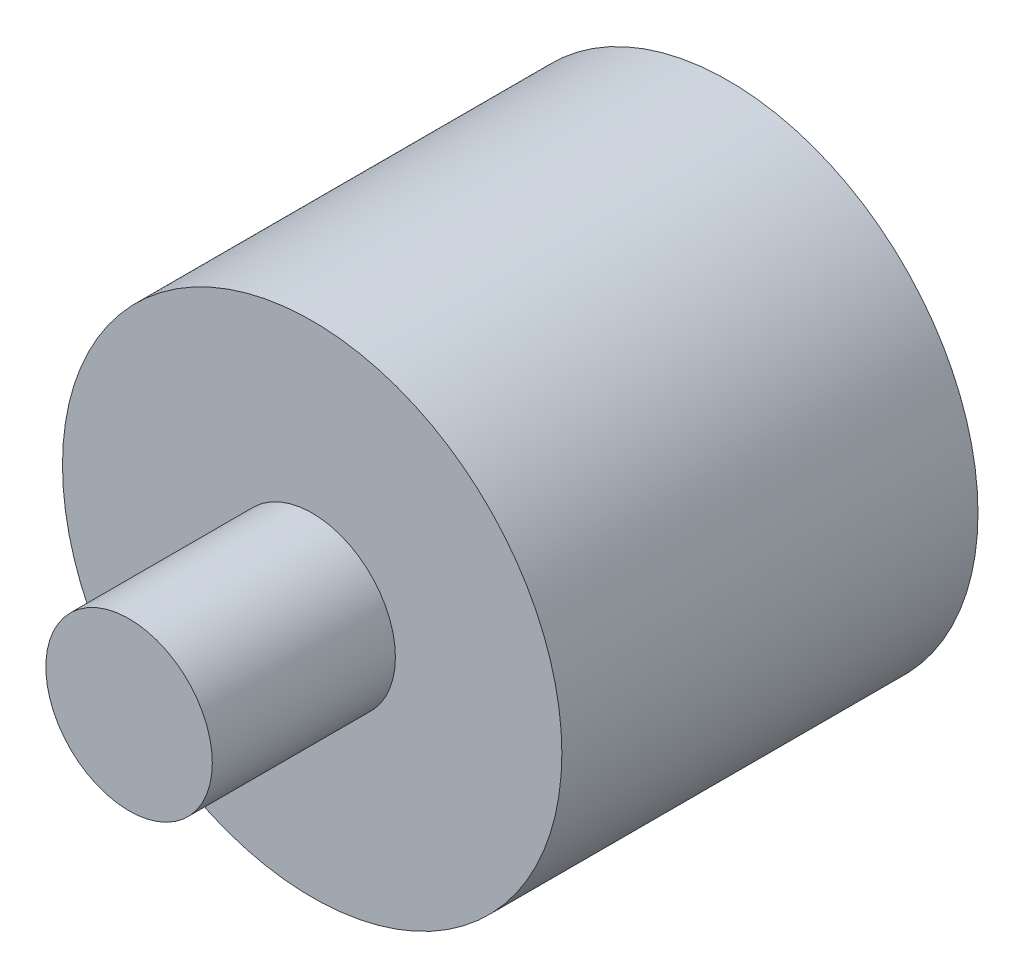
ISO-10303-21;
HEADER;
FILE_DESCRIPTION(('STEP AP214'),'2;1');
FILE_NAME('part.step','',(''),(''),'','','');
FILE_SCHEMA(('AUTOMOTIVE_DESIGN { 1 0 10303 214 1 1 1 1 }'));
ENDSEC;
DATA;
#1=APPLICATION_CONTEXT('core data for automotive mechanical design processes');
#2=APPLICATION_PROTOCOL_DEFINITION('international standard','automotive_design',2000,#1);
#3=PRODUCT_CONTEXT('',#1,'mechanical');
#4=PRODUCT('Part','Part','',(#3));
#5=PRODUCT_RELATED_PRODUCT_CATEGORY('part','',(#4));
#6=PRODUCT_DEFINITION_FORMATION('','',#4);
#7=PRODUCT_DEFINITION_CONTEXT('part definition',#1,'design');
#8=PRODUCT_DEFINITION('design','',#6,#7);
#9=PRODUCT_DEFINITION_SHAPE('','',#8);
#10=(LENGTH_UNIT() NAMED_UNIT(*) SI_UNIT(.MILLI.,.METRE.));
#11=(NAMED_UNIT(*) PLANE_ANGLE_UNIT() SI_UNIT($,.RADIAN.));
#12=(NAMED_UNIT(*) SI_UNIT($,.STERADIAN.) SOLID_ANGLE_UNIT());
#13=UNCERTAINTY_MEASURE_WITH_UNIT(LENGTH_MEASURE(1.E-05),#10,'distance_accuracy_value','');
#14=(GEOMETRIC_REPRESENTATION_CONTEXT(3) GLOBAL_UNCERTAINTY_ASSIGNED_CONTEXT((#13)) GLOBAL_UNIT_ASSIGNED_CONTEXT((#10,
#11,#12)) REPRESENTATION_CONTEXT('',''));
#15=CARTESIAN_POINT('',(0.,0.,0.));
#16=DIRECTION('',(0.,0.,1.));
#17=DIRECTION('',(1.,0.,0.));
#18=AXIS2_PLACEMENT_3D('',#15,#16,#17);
#19=CARTESIAN_POINT('',(0.,0.,22.));
#20=DIRECTION('',(0.,0.,-1.));
#21=DIRECTION('',(-1.,0.,0.));
#22=AXIS2_PLACEMENT_3D('',#19,#20,#21);
#23=CYLINDRICAL_SURFACE('',#22,10.);
#24=CARTESIAN_POINT('',(0.,0.,22.));
#25=DIRECTION('',(0.,0.,1.));
#26=DIRECTION('',(1.,0.,0.));
#27=AXIS2_PLACEMENT_3D('',#24,#25,#26);
#28=CIRCLE('',#27,10.);
#29=CARTESIAN_POINT('',(10.,0.,22.));
#30=VERTEX_POINT('',#29);
#31=EDGE_CURVE('E10',#30,#30,#28,.T.);
#32=ORIENTED_EDGE('',*,*,#31,.F.);
#33=EDGE_LOOP('',(#32));
#34=FACE_BOUND('',#33,.T.);
#35=CARTESIAN_POINT('',(0.,0.,0.));
#36=DIRECTION('',(0.,0.,1.));
#37=DIRECTION('',(1.,0.,0.));
#38=AXIS2_PLACEMENT_3D('',#35,#36,#37);
#39=CIRCLE('',#38,10.);
#40=CARTESIAN_POINT('',(10.,0.,0.));
#41=VERTEX_POINT('',#40);
#42=EDGE_CURVE('E37',#41,#41,#39,.T.);
#43=ORIENTED_EDGE('',*,*,#42,.T.);
#44=EDGE_LOOP('',(#43));
#45=FACE_BOUND('',#44,.T.);
#46=ADVANCED_FACE('F31',(#34,#45),#23,.T.);
#47=CARTESIAN_POINT('',(0.,0.,22.));
#48=DIRECTION('',(0.,0.,1.));
#49=DIRECTION('',(1.,0.,0.));
#50=AXIS2_PLACEMENT_3D('',#47,#48,#49);
#51=PLANE('',#50);
#52=ORIENTED_EDGE('',*,*,#31,.T.);
#53=EDGE_LOOP('',(#52));
#54=FACE_BOUND('',#53,.T.);
#55=ADVANCED_FACE('F64',(#54),#51,.T.);
#56=CARTESIAN_POINT('',(0.,0.,-50.));
#57=DIRECTION('',(0.,0.,1.));
#58=DIRECTION('',(1.,0.,0.));
#59=AXIS2_PLACEMENT_3D('',#56,#57,#58);
#60=CYLINDRICAL_SURFACE('',#59,30.);
#61=CARTESIAN_POINT('',(0.,0.,-50.));
#62=DIRECTION('',(0.,0.,-1.));
#63=DIRECTION('',(-1.,0.,0.));
#64=AXIS2_PLACEMENT_3D('',#61,#62,#63);
#65=CIRCLE('',#64,30.);
#66=CARTESIAN_POINT('',(-30.,0.,-50.));
#67=VERTEX_POINT('',#66);
#68=EDGE_CURVE('E41',#67,#67,#65,.T.);
#69=ORIENTED_EDGE('',*,*,#68,.F.);
#70=EDGE_LOOP('',(#69));
#71=FACE_BOUND('',#70,.T.);
#72=CARTESIAN_POINT('',(0.,0.,0.));
#73=DIRECTION('',(0.,0.,-1.));
#74=DIRECTION('',(-1.,0.,0.));
#75=AXIS2_PLACEMENT_3D('',#72,#73,#74);
#76=CIRCLE('',#75,30.);
#77=CARTESIAN_POINT('',(-30.,0.,0.));
#78=VERTEX_POINT('',#77);
#79=EDGE_CURVE('E45',#78,#78,#76,.T.);
#80=ORIENTED_EDGE('',*,*,#79,.T.);
#81=EDGE_LOOP('',(#80));
#82=FACE_BOUND('',#81,.T.);
#83=ADVANCED_FACE('F51',(#71,#82),#60,.T.);
#84=CARTESIAN_POINT('',(0.,0.,-50.));
#85=DIRECTION('',(0.,0.,-1.));
#86=DIRECTION('',(-1.,0.,0.));
#87=AXIS2_PLACEMENT_3D('',#84,#85,#86);
#88=PLANE('',#87);
#89=ORIENTED_EDGE('',*,*,#68,.T.);
#90=EDGE_LOOP('',(#89));
#91=FACE_BOUND('',#90,.T.);
#92=ADVANCED_FACE('F55',(#91),#88,.T.);
#93=CARTESIAN_POINT('',(0.,0.,0.));
#94=DIRECTION('',(0.,0.,-1.));
#95=DIRECTION('',(-1.,0.,0.));
#96=AXIS2_PLACEMENT_3D('',#93,#94,#95);
#97=PLANE('',#96);
#98=ORIENTED_EDGE('',*,*,#42,.F.);
#99=EDGE_LOOP('',(#98));
#100=FACE_BOUND('',#99,.T.);
#101=ORIENTED_EDGE('',*,*,#79,.F.);
#102=EDGE_LOOP('',(#101));
#103=FACE_BOUND('',#102,.T.);
#104=ADVANCED_FACE('F53',(#100,#103),#97,.F.);
#105=CLOSED_SHELL('',(#46,#55,#83,#92,#104));
#106=MANIFOLD_SOLID_BREP('B2',#105);
#107=ADVANCED_BREP_SHAPE_REPRESENTATION('',(#18,#106),#14);
#108=SHAPE_DEFINITION_REPRESENTATION(#9,#107);
ENDSEC;
END-ISO-10303-21;
